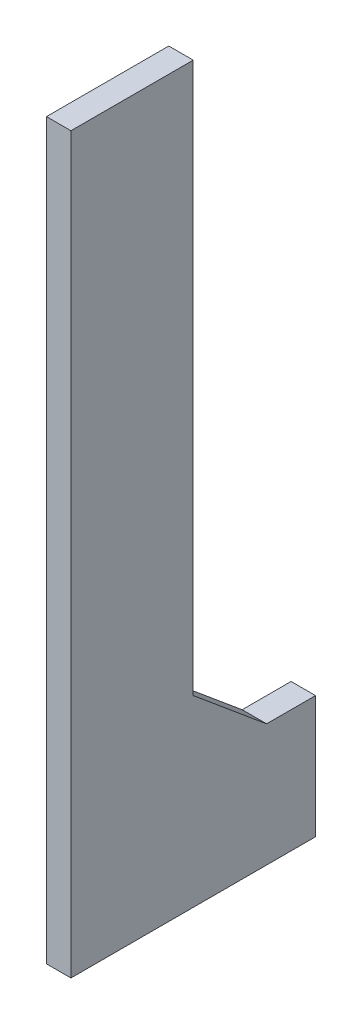
ISO-10303-21;
HEADER;
FILE_DESCRIPTION(('STEP AP214'),'2;1');
FILE_NAME('part.step','',(''),(''),'','','');
FILE_SCHEMA(('AUTOMOTIVE_DESIGN { 1 0 10303 214 1 1 1 1 }'));
ENDSEC;
DATA;
#1=APPLICATION_CONTEXT('core data for automotive mechanical design processes');
#2=APPLICATION_PROTOCOL_DEFINITION('international standard','automotive_design',2000,#1);
#3=PRODUCT_CONTEXT('',#1,'mechanical');
#4=PRODUCT('Part','Part','',(#3));
#5=PRODUCT_RELATED_PRODUCT_CATEGORY('part','',(#4));
#6=PRODUCT_DEFINITION_FORMATION('','',#4);
#7=PRODUCT_DEFINITION_CONTEXT('part definition',#1,'design');
#8=PRODUCT_DEFINITION('design','',#6,#7);
#9=PRODUCT_DEFINITION_SHAPE('','',#8);
#10=(LENGTH_UNIT() NAMED_UNIT(*) SI_UNIT(.MILLI.,.METRE.));
#11=(NAMED_UNIT(*) PLANE_ANGLE_UNIT() SI_UNIT($,.RADIAN.));
#12=(NAMED_UNIT(*) SI_UNIT($,.STERADIAN.) SOLID_ANGLE_UNIT());
#13=UNCERTAINTY_MEASURE_WITH_UNIT(LENGTH_MEASURE(1.E-05),#10,'distance_accuracy_value','');
#14=(GEOMETRIC_REPRESENTATION_CONTEXT(3) GLOBAL_UNCERTAINTY_ASSIGNED_CONTEXT((#13)) GLOBAL_UNIT_ASSIGNED_CONTEXT((#10,
#11,#12)) REPRESENTATION_CONTEXT('',''));
#15=CARTESIAN_POINT('',(0.,0.,0.));
#16=DIRECTION('',(0.,0.,1.));
#17=DIRECTION('',(1.,0.,0.));
#18=AXIS2_PLACEMENT_3D('',#15,#16,#17);
#19=CARTESIAN_POINT('',(10.,300.,0.));
#20=DIRECTION('',(0.,0.,-1.));
#21=DIRECTION('',(0.,1.,0.));
#22=AXIS2_PLACEMENT_3D('',#19,#20,#21);
#23=PLANE('',#22);
#24=DIRECTION('',(0.,-1.,0.));
#25=VECTOR('',#24,1.);
#26=CARTESIAN_POINT('',(0.,300.,0.));
#27=LINE('',#26,#25);
#28=CARTESIAN_POINT('',(0.,300.,0.));
#29=VERTEX_POINT('',#28);
#30=CARTESIAN_POINT('',(0.,0.,0.));
#31=VERTEX_POINT('',#30);
#32=EDGE_CURVE('E125',#29,#31,#27,.T.);
#33=ORIENTED_EDGE('',*,*,#32,.T.);
#34=DIRECTION('',(-1.,0.,0.));
#35=VECTOR('',#34,1.);
#36=CARTESIAN_POINT('',(10.,0.,0.));
#37=LINE('',#36,#35);
#38=CARTESIAN_POINT('',(10.,0.,0.));
#39=VERTEX_POINT('',#38);
#40=EDGE_CURVE('E11',#39,#31,#37,.T.);
#41=ORIENTED_EDGE('',*,*,#40,.F.);
#42=DIRECTION('',(0.,-1.,0.));
#43=VECTOR('',#42,1.);
#44=CARTESIAN_POINT('',(10.,300.,0.));
#45=LINE('',#44,#43);
#46=CARTESIAN_POINT('',(10.,300.,0.));
#47=VERTEX_POINT('',#46);
#48=EDGE_CURVE('E137',#47,#39,#45,.T.);
#49=ORIENTED_EDGE('',*,*,#48,.F.);
#50=DIRECTION('',(-1.,0.,0.));
#51=VECTOR('',#50,1.);
#52=CARTESIAN_POINT('',(10.,300.,0.));
#53=LINE('',#52,#51);
#54=EDGE_CURVE('E121',#47,#29,#53,.T.);
#55=ORIENTED_EDGE('',*,*,#54,.T.);
#56=EDGE_LOOP('',(#33,#41,#49,#55));
#57=FACE_BOUND('',#56,.T.);
#58=ADVANCED_FACE('F35',(#57),#23,.F.);
#59=CARTESIAN_POINT('',(10.,0.,0.));
#60=DIRECTION('',(0.,1.,0.));
#61=DIRECTION('',(0.,0.,1.));
#62=AXIS2_PLACEMENT_3D('',#59,#60,#61);
#63=PLANE('',#62);
#64=DIRECTION('',(0.,0.,-1.));
#65=VECTOR('',#64,1.);
#66=CARTESIAN_POINT('',(0.,0.,0.));
#67=LINE('',#66,#65);
#68=CARTESIAN_POINT('',(0.,0.,-100.));
#69=VERTEX_POINT('',#68);
#70=EDGE_CURVE('E128',#31,#69,#67,.T.);
#71=ORIENTED_EDGE('',*,*,#70,.T.);
#72=DIRECTION('',(-1.,0.,0.));
#73=VECTOR('',#72,1.);
#74=CARTESIAN_POINT('',(10.,0.,-100.));
#75=LINE('',#74,#73);
#76=CARTESIAN_POINT('',(10.,0.,-100.));
#77=VERTEX_POINT('',#76);
#78=EDGE_CURVE('E43',#77,#69,#75,.T.);
#79=ORIENTED_EDGE('',*,*,#78,.F.);
#80=DIRECTION('',(0.,0.,-1.));
#81=VECTOR('',#80,1.);
#82=CARTESIAN_POINT('',(10.,0.,0.));
#83=LINE('',#82,#81);
#84=EDGE_CURVE('E91',#39,#77,#83,.T.);
#85=ORIENTED_EDGE('',*,*,#84,.F.);
#86=ORIENTED_EDGE('',*,*,#40,.T.);
#87=EDGE_LOOP('',(#71,#79,#85,#86));
#88=FACE_BOUND('',#87,.T.);
#89=ADVANCED_FACE('F162',(#88),#63,.F.);
#90=CARTESIAN_POINT('',(10.,0.,-100.));
#91=DIRECTION('',(0.,0.,1.));
#92=DIRECTION('',(1.,0.,0.));
#93=AXIS2_PLACEMENT_3D('',#90,#91,#92);
#94=PLANE('',#93);
#95=DIRECTION('',(0.,1.,0.));
#96=VECTOR('',#95,1.);
#97=CARTESIAN_POINT('',(0.,0.,-100.));
#98=LINE('',#97,#96);
#99=CARTESIAN_POINT('',(0.,50.,-100.));
#100=VERTEX_POINT('',#99);
#101=EDGE_CURVE('E130',#69,#100,#98,.T.);
#102=ORIENTED_EDGE('',*,*,#101,.T.);
#103=DIRECTION('',(-1.,0.,0.));
#104=VECTOR('',#103,1.);
#105=CARTESIAN_POINT('',(10.,50.,-100.));
#106=LINE('',#105,#104);
#107=CARTESIAN_POINT('',(10.,50.,-100.));
#108=VERTEX_POINT('',#107);
#109=EDGE_CURVE('E141',#108,#100,#106,.T.);
#110=ORIENTED_EDGE('',*,*,#109,.F.);
#111=DIRECTION('',(0.,1.,0.));
#112=VECTOR('',#111,1.);
#113=CARTESIAN_POINT('',(10.,0.,-100.));
#114=LINE('',#113,#112);
#115=EDGE_CURVE('E149',#77,#108,#114,.T.);
#116=ORIENTED_EDGE('',*,*,#115,.F.);
#117=ORIENTED_EDGE('',*,*,#78,.T.);
#118=EDGE_LOOP('',(#102,#110,#116,#117));
#119=FACE_BOUND('',#118,.T.);
#120=ADVANCED_FACE('F147',(#119),#94,.F.);
#121=CARTESIAN_POINT('',(10.,50.,-100.));
#122=DIRECTION('',(0.,-1.,0.));
#123=DIRECTION('',(0.,0.,-1.));
#124=AXIS2_PLACEMENT_3D('',#121,#122,#123);
#125=PLANE('',#124);
#126=DIRECTION('',(0.,0.,1.));
#127=VECTOR('',#126,1.);
#128=CARTESIAN_POINT('',(0.,50.,-100.));
#129=LINE('',#128,#127);
#130=CARTESIAN_POINT('',(0.,50.,-80.));
#131=VERTEX_POINT('',#130);
#132=EDGE_CURVE('E132',#100,#131,#129,.T.);
#133=ORIENTED_EDGE('',*,*,#132,.T.);
#134=DIRECTION('',(-1.,0.,0.));
#135=VECTOR('',#134,1.);
#136=CARTESIAN_POINT('',(10.,50.,-80.));
#137=LINE('',#136,#135);
#138=CARTESIAN_POINT('',(10.,50.,-80.));
#139=VERTEX_POINT('',#138);
#140=EDGE_CURVE('E116',#139,#131,#137,.T.);
#141=ORIENTED_EDGE('',*,*,#140,.F.);
#142=DIRECTION('',(0.,0.,1.));
#143=VECTOR('',#142,1.);
#144=CARTESIAN_POINT('',(10.,50.,-100.));
#145=LINE('',#144,#143);
#146=EDGE_CURVE('E107',#108,#139,#145,.T.);
#147=ORIENTED_EDGE('',*,*,#146,.F.);
#148=ORIENTED_EDGE('',*,*,#109,.T.);
#149=EDGE_LOOP('',(#133,#141,#147,#148));
#150=FACE_BOUND('',#149,.T.);
#151=ADVANCED_FACE('F155',(#150),#125,.F.);
#152=CARTESIAN_POINT('',(10.,50.,-80.));
#153=DIRECTION('',(0.,-0.768221279597376,0.64018439966448));
#154=DIRECTION('',(0.,-0.64018439966448,-0.768221279597376));
#155=AXIS2_PLACEMENT_3D('',#152,#153,#154);
#156=PLANE('',#155);
#157=DIRECTION('',(0.,0.64018439966448,0.768221279597376));
#158=VECTOR('',#157,1.);
#159=CARTESIAN_POINT('',(0.,50.,-80.));
#160=LINE('',#159,#158);
#161=CARTESIAN_POINT('',(0.,75.,-50.));
#162=VERTEX_POINT('',#161);
#163=EDGE_CURVE('E115',#131,#162,#160,.T.);
#164=ORIENTED_EDGE('',*,*,#163,.T.);
#165=DIRECTION('',(-1.,0.,0.));
#166=VECTOR('',#165,1.);
#167=CARTESIAN_POINT('',(10.,75.,-50.));
#168=LINE('',#167,#166);
#169=CARTESIAN_POINT('',(10.,75.,-50.));
#170=VERTEX_POINT('',#169);
#171=EDGE_CURVE('E112',#170,#162,#168,.T.);
#172=ORIENTED_EDGE('',*,*,#171,.F.);
#173=DIRECTION('',(0.,0.64018439966448,0.768221279597376));
#174=VECTOR('',#173,1.);
#175=CARTESIAN_POINT('',(10.,50.,-80.));
#176=LINE('',#175,#174);
#177=EDGE_CURVE('E101',#139,#170,#176,.T.);
#178=ORIENTED_EDGE('',*,*,#177,.F.);
#179=ORIENTED_EDGE('',*,*,#140,.T.);
#180=EDGE_LOOP('',(#164,#172,#178,#179));
#181=FACE_BOUND('',#180,.T.);
#182=ADVANCED_FACE('F113',(#181),#156,.F.);
#183=CARTESIAN_POINT('',(10.,75.,-50.));
#184=DIRECTION('',(0.,0.,1.));
#185=DIRECTION('',(1.,0.,0.));
#186=AXIS2_PLACEMENT_3D('',#183,#184,#185);
#187=PLANE('',#186);
#188=DIRECTION('',(0.,1.,0.));
#189=VECTOR('',#188,1.);
#190=CARTESIAN_POINT('',(0.,75.,-50.));
#191=LINE('',#190,#189);
#192=CARTESIAN_POINT('',(0.,300.,-50.));
#193=VERTEX_POINT('',#192);
#194=EDGE_CURVE('E77',#162,#193,#191,.T.);
#195=ORIENTED_EDGE('',*,*,#194,.T.);
#196=DIRECTION('',(-1.,0.,0.));
#197=VECTOR('',#196,1.);
#198=CARTESIAN_POINT('',(10.,300.,-50.));
#199=LINE('',#198,#197);
#200=CARTESIAN_POINT('',(10.,300.,-50.));
#201=VERTEX_POINT('',#200);
#202=EDGE_CURVE('E117',#201,#193,#199,.T.);
#203=ORIENTED_EDGE('',*,*,#202,.F.);
#204=DIRECTION('',(0.,1.,0.));
#205=VECTOR('',#204,1.);
#206=CARTESIAN_POINT('',(10.,75.,-50.));
#207=LINE('',#206,#205);
#208=EDGE_CURVE('E105',#170,#201,#207,.T.);
#209=ORIENTED_EDGE('',*,*,#208,.F.);
#210=ORIENTED_EDGE('',*,*,#171,.T.);
#211=EDGE_LOOP('',(#195,#203,#209,#210));
#212=FACE_BOUND('',#211,.T.);
#213=ADVANCED_FACE('F119',(#212),#187,.F.);
#214=CARTESIAN_POINT('',(10.,300.,-50.));
#215=DIRECTION('',(0.,-1.,0.));
#216=DIRECTION('',(0.,0.,-1.));
#217=AXIS2_PLACEMENT_3D('',#214,#215,#216);
#218=PLANE('',#217);
#219=DIRECTION('',(0.,0.,1.));
#220=VECTOR('',#219,1.);
#221=CARTESIAN_POINT('',(0.,300.,-50.));
#222=LINE('',#221,#220);
#223=EDGE_CURVE('E83',#193,#29,#222,.T.);
#224=ORIENTED_EDGE('',*,*,#223,.T.);
#225=ORIENTED_EDGE('',*,*,#54,.F.);
#226=DIRECTION('',(0.,0.,1.));
#227=VECTOR('',#226,1.);
#228=CARTESIAN_POINT('',(10.,300.,-50.));
#229=LINE('',#228,#227);
#230=EDGE_CURVE('E51',#201,#47,#229,.T.);
#231=ORIENTED_EDGE('',*,*,#230,.F.);
#232=ORIENTED_EDGE('',*,*,#202,.T.);
#233=EDGE_LOOP('',(#224,#225,#231,#232));
#234=FACE_BOUND('',#233,.T.);
#235=ADVANCED_FACE('F176',(#234),#218,.F.);
#236=CARTESIAN_POINT('',(10.,0.,0.));
#237=DIRECTION('',(1.,0.,0.));
#238=DIRECTION('',(0.,0.,-1.));
#239=AXIS2_PLACEMENT_3D('',#236,#237,#238);
#240=PLANE('',#239);
#241=ORIENTED_EDGE('',*,*,#48,.T.);
#242=ORIENTED_EDGE('',*,*,#84,.T.);
#243=ORIENTED_EDGE('',*,*,#115,.T.);
#244=ORIENTED_EDGE('',*,*,#146,.T.);
#245=ORIENTED_EDGE('',*,*,#177,.T.);
#246=ORIENTED_EDGE('',*,*,#208,.T.);
#247=ORIENTED_EDGE('',*,*,#230,.T.);
#248=EDGE_LOOP('',(#241,#242,#243,#244,#245,#246,#247));
#249=FACE_BOUND('',#248,.T.);
#250=ADVANCED_FACE('F103',(#249),#240,.T.);
#251=CARTESIAN_POINT('',(0.,0.,0.));
#252=DIRECTION('',(1.,0.,0.));
#253=DIRECTION('',(0.,0.,-1.));
#254=AXIS2_PLACEMENT_3D('',#251,#252,#253);
#255=PLANE('',#254);
#256=ORIENTED_EDGE('',*,*,#32,.F.);
#257=ORIENTED_EDGE('',*,*,#223,.F.);
#258=ORIENTED_EDGE('',*,*,#194,.F.);
#259=ORIENTED_EDGE('',*,*,#163,.F.);
#260=ORIENTED_EDGE('',*,*,#132,.F.);
#261=ORIENTED_EDGE('',*,*,#101,.F.);
#262=ORIENTED_EDGE('',*,*,#70,.F.);
#263=EDGE_LOOP('',(#256,#257,#258,#259,#260,#261,#262));
#264=FACE_BOUND('',#263,.T.);
#265=ADVANCED_FACE('F153',(#264),#255,.F.);
#266=CLOSED_SHELL('',(#58,#89,#120,#151,#182,#213,#235,#250,#265));
#267=MANIFOLD_SOLID_BREP('B2',#266);
#268=ADVANCED_BREP_SHAPE_REPRESENTATION('',(#18,#267),#14);
#269=SHAPE_DEFINITION_REPRESENTATION(#9,#268);
ENDSEC;
END-ISO-10303-21;
